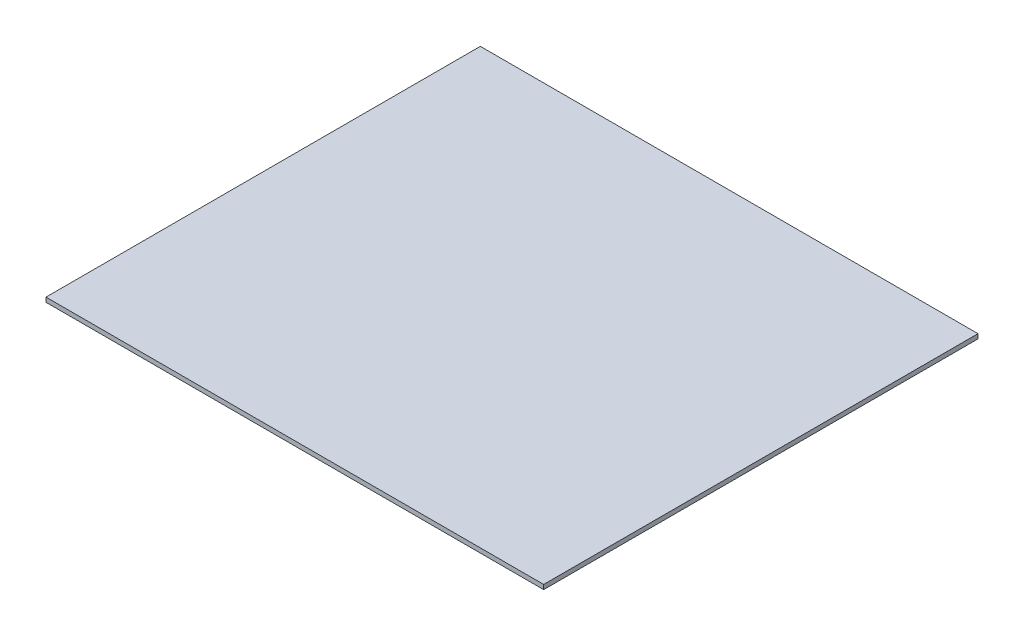
ISO-10303-21;
HEADER;
FILE_DESCRIPTION(('STEP AP214'),'2;1');
FILE_NAME('part.step','',(''),(''),'','','');
FILE_SCHEMA(('AUTOMOTIVE_DESIGN { 1 0 10303 214 1 1 1 1 }'));
ENDSEC;
DATA;
#1=APPLICATION_CONTEXT('core data for automotive mechanical design processes');
#2=APPLICATION_PROTOCOL_DEFINITION('international standard','automotive_design',2000,#1);
#3=PRODUCT_CONTEXT('',#1,'mechanical');
#4=PRODUCT('Part','Part','',(#3));
#5=PRODUCT_RELATED_PRODUCT_CATEGORY('part','',(#4));
#6=PRODUCT_DEFINITION_FORMATION('','',#4);
#7=PRODUCT_DEFINITION_CONTEXT('part definition',#1,'design');
#8=PRODUCT_DEFINITION('design','',#6,#7);
#9=PRODUCT_DEFINITION_SHAPE('','',#8);
#10=(LENGTH_UNIT() NAMED_UNIT(*) SI_UNIT(.MILLI.,.METRE.));
#11=(NAMED_UNIT(*) PLANE_ANGLE_UNIT() SI_UNIT($,.RADIAN.));
#12=(NAMED_UNIT(*) SI_UNIT($,.STERADIAN.) SOLID_ANGLE_UNIT());
#13=UNCERTAINTY_MEASURE_WITH_UNIT(LENGTH_MEASURE(1.E-05),#10,'distance_accuracy_value','');
#14=(GEOMETRIC_REPRESENTATION_CONTEXT(3) GLOBAL_UNCERTAINTY_ASSIGNED_CONTEXT((#13)) GLOBAL_UNIT_ASSIGNED_CONTEXT((#10,
#11,#12)) REPRESENTATION_CONTEXT('',''));
#15=CARTESIAN_POINT('',(0.,0.,0.));
#16=DIRECTION('',(0.,0.,1.));
#17=DIRECTION('',(1.,0.,0.));
#18=AXIS2_PLACEMENT_3D('',#15,#16,#17);
#19=CARTESIAN_POINT('',(698.5,12.7,-609.6));
#20=DIRECTION('',(1.,0.,0.));
#21=DIRECTION('',(0.,0.,-1.));
#22=AXIS2_PLACEMENT_3D('',#19,#20,#21);
#23=PLANE('',#22);
#24=DIRECTION('',(0.,0.,1.));
#25=VECTOR('',#24,1.);
#26=CARTESIAN_POINT('',(698.5,0.,-609.6));
#27=LINE('',#26,#25);
#28=CARTESIAN_POINT('',(698.5,0.,-609.6));
#29=VERTEX_POINT('',#28);
#30=CARTESIAN_POINT('',(698.5,0.,609.6));
#31=VERTEX_POINT('',#30);
#32=EDGE_CURVE('E98',#29,#31,#27,.T.);
#33=ORIENTED_EDGE('',*,*,#32,.F.);
#34=DIRECTION('',(0.,-1.,0.));
#35=VECTOR('',#34,1.);
#36=CARTESIAN_POINT('',(698.5,12.7,-609.6));
#37=LINE('',#36,#35);
#38=CARTESIAN_POINT('',(698.5,12.7,-609.6));
#39=VERTEX_POINT('',#38);
#40=EDGE_CURVE('E11',#39,#29,#37,.T.);
#41=ORIENTED_EDGE('',*,*,#40,.F.);
#42=DIRECTION('',(0.,0.,1.));
#43=VECTOR('',#42,1.);
#44=CARTESIAN_POINT('',(698.5,12.7,-609.6));
#45=LINE('',#44,#43);
#46=CARTESIAN_POINT('',(698.5,12.7,609.6));
#47=VERTEX_POINT('',#46);
#48=EDGE_CURVE('E93',#39,#47,#45,.T.);
#49=ORIENTED_EDGE('',*,*,#48,.T.);
#50=DIRECTION('',(0.,-1.,0.));
#51=VECTOR('',#50,1.);
#52=CARTESIAN_POINT('',(698.5,12.7,609.6));
#53=LINE('',#52,#51);
#54=EDGE_CURVE('E36',#47,#31,#53,.T.);
#55=ORIENTED_EDGE('',*,*,#54,.T.);
#56=EDGE_LOOP('',(#33,#41,#49,#55));
#57=FACE_BOUND('',#56,.T.);
#58=ADVANCED_FACE('F33',(#57),#23,.T.);
#59=CARTESIAN_POINT('',(698.5,12.7,-609.6));
#60=DIRECTION('',(0.,0.,1.));
#61=DIRECTION('',(1.,0.,0.));
#62=AXIS2_PLACEMENT_3D('',#59,#60,#61);
#63=PLANE('',#62);
#64=DIRECTION('',(-1.,0.,0.));
#65=VECTOR('',#64,1.);
#66=CARTESIAN_POINT('',(698.5,0.,-609.6));
#67=LINE('',#66,#65);
#68=CARTESIAN_POINT('',(-698.5,0.,-609.6));
#69=VERTEX_POINT('',#68);
#70=EDGE_CURVE('E66',#29,#69,#67,.T.);
#71=ORIENTED_EDGE('',*,*,#70,.T.);
#72=DIRECTION('',(0.,-1.,0.));
#73=VECTOR('',#72,1.);
#74=CARTESIAN_POINT('',(-698.5,12.7,-609.6));
#75=LINE('',#74,#73);
#76=CARTESIAN_POINT('',(-698.5,12.7,-609.6));
#77=VERTEX_POINT('',#76);
#78=EDGE_CURVE('E42',#77,#69,#75,.T.);
#79=ORIENTED_EDGE('',*,*,#78,.F.);
#80=DIRECTION('',(-1.,0.,0.));
#81=VECTOR('',#80,1.);
#82=CARTESIAN_POINT('',(698.5,12.7,-609.6));
#83=LINE('',#82,#81);
#84=EDGE_CURVE('E83',#39,#77,#83,.T.);
#85=ORIENTED_EDGE('',*,*,#84,.F.);
#86=ORIENTED_EDGE('',*,*,#40,.T.);
#87=EDGE_LOOP('',(#71,#79,#85,#86));
#88=FACE_BOUND('',#87,.T.);
#89=ADVANCED_FACE('F108',(#88),#63,.F.);
#90=CARTESIAN_POINT('',(-698.5,12.7,-609.6));
#91=DIRECTION('',(1.,0.,0.));
#92=DIRECTION('',(0.,0.,-1.));
#93=AXIS2_PLACEMENT_3D('',#90,#91,#92);
#94=PLANE('',#93);
#95=DIRECTION('',(0.,0.,1.));
#96=VECTOR('',#95,1.);
#97=CARTESIAN_POINT('',(-698.5,0.,-609.6));
#98=LINE('',#97,#96);
#99=CARTESIAN_POINT('',(-698.5,0.,609.6));
#100=VERTEX_POINT('',#99);
#101=EDGE_CURVE('E90',#69,#100,#98,.T.);
#102=ORIENTED_EDGE('',*,*,#101,.T.);
#103=DIRECTION('',(0.,-1.,0.));
#104=VECTOR('',#103,1.);
#105=CARTESIAN_POINT('',(-698.5,12.7,609.6));
#106=LINE('',#105,#104);
#107=CARTESIAN_POINT('',(-698.5,12.7,609.6));
#108=VERTEX_POINT('',#107);
#109=EDGE_CURVE('E87',#108,#100,#106,.T.);
#110=ORIENTED_EDGE('',*,*,#109,.F.);
#111=DIRECTION('',(0.,0.,1.));
#112=VECTOR('',#111,1.);
#113=CARTESIAN_POINT('',(-698.5,12.7,-609.6));
#114=LINE('',#113,#112);
#115=EDGE_CURVE('E78',#77,#108,#114,.T.);
#116=ORIENTED_EDGE('',*,*,#115,.F.);
#117=ORIENTED_EDGE('',*,*,#78,.T.);
#118=EDGE_LOOP('',(#102,#110,#116,#117));
#119=FACE_BOUND('',#118,.T.);
#120=ADVANCED_FACE('F88',(#119),#94,.F.);
#121=CARTESIAN_POINT('',(698.5,12.7,609.6));
#122=DIRECTION('',(0.,0.,1.));
#123=DIRECTION('',(1.,0.,0.));
#124=AXIS2_PLACEMENT_3D('',#121,#122,#123);
#125=PLANE('',#124);
#126=DIRECTION('',(-1.,0.,0.));
#127=VECTOR('',#126,1.);
#128=CARTESIAN_POINT('',(698.5,0.,609.6));
#129=LINE('',#128,#127);
#130=EDGE_CURVE('E101',#31,#100,#129,.T.);
#131=ORIENTED_EDGE('',*,*,#130,.F.);
#132=ORIENTED_EDGE('',*,*,#54,.F.);
#133=DIRECTION('',(-1.,0.,0.));
#134=VECTOR('',#133,1.);
#135=CARTESIAN_POINT('',(698.5,12.7,609.6));
#136=LINE('',#135,#134);
#137=EDGE_CURVE('E82',#47,#108,#136,.T.);
#138=ORIENTED_EDGE('',*,*,#137,.T.);
#139=ORIENTED_EDGE('',*,*,#109,.T.);
#140=EDGE_LOOP('',(#131,#132,#138,#139));
#141=FACE_BOUND('',#140,.T.);
#142=ADVANCED_FACE('F92',(#141),#125,.T.);
#143=CARTESIAN_POINT('',(0.,12.7,0.));
#144=DIRECTION('',(0.,-1.,0.));
#145=DIRECTION('',(0.,0.,-1.));
#146=AXIS2_PLACEMENT_3D('',#143,#144,#145);
#147=PLANE('',#146);
#148=ORIENTED_EDGE('',*,*,#48,.F.);
#149=ORIENTED_EDGE('',*,*,#84,.T.);
#150=ORIENTED_EDGE('',*,*,#115,.T.);
#151=ORIENTED_EDGE('',*,*,#137,.F.);
#152=EDGE_LOOP('',(#148,#149,#150,#151));
#153=FACE_BOUND('',#152,.T.);
#154=ADVANCED_FACE('F81',(#153),#147,.F.);
#155=CARTESIAN_POINT('',(0.,0.,0.));
#156=DIRECTION('',(0.,-1.,0.));
#157=DIRECTION('',(0.,0.,-1.));
#158=AXIS2_PLACEMENT_3D('',#155,#156,#157);
#159=PLANE('',#158);
#160=ORIENTED_EDGE('',*,*,#32,.T.);
#161=ORIENTED_EDGE('',*,*,#130,.T.);
#162=ORIENTED_EDGE('',*,*,#101,.F.);
#163=ORIENTED_EDGE('',*,*,#70,.F.);
#164=EDGE_LOOP('',(#160,#161,#162,#163));
#165=FACE_BOUND('',#164,.T.);
#166=ADVANCED_FACE('F106',(#165),#159,.T.);
#167=CLOSED_SHELL('',(#58,#89,#120,#142,#154,#166));
#168=MANIFOLD_SOLID_BREP('B2',#167);
#169=ADVANCED_BREP_SHAPE_REPRESENTATION('',(#18,#168),#14);
#170=SHAPE_DEFINITION_REPRESENTATION(#9,#169);
ENDSEC;
END-ISO-10303-21;
